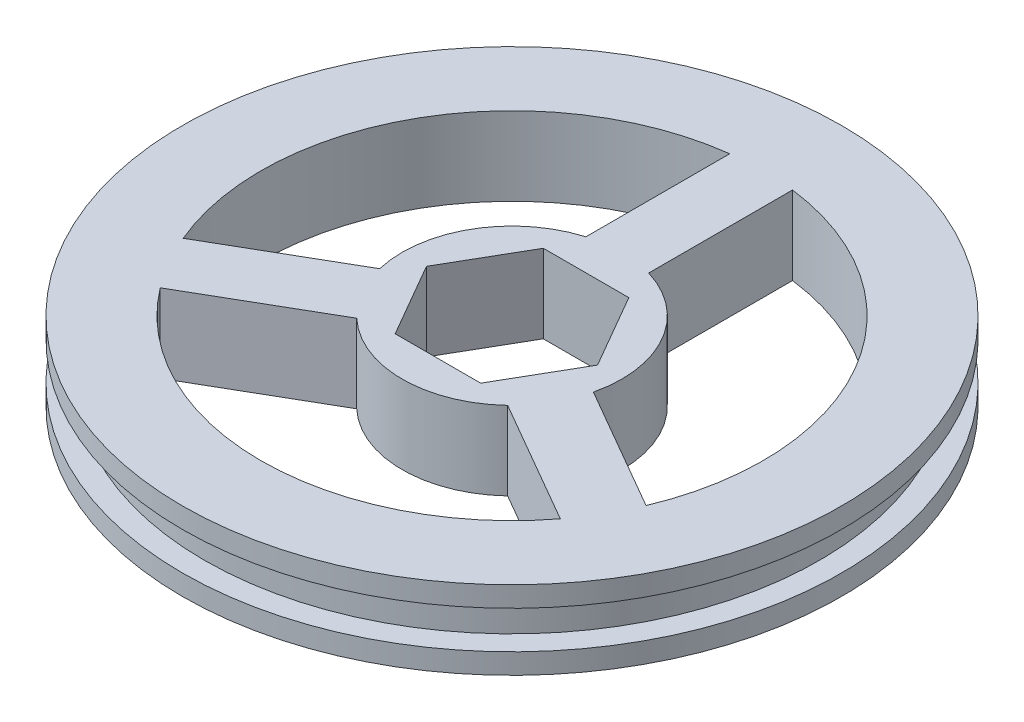
ISO-10303-21;
HEADER;
FILE_DESCRIPTION(('STEP AP214'),'2;1');
FILE_NAME('part.step','',(''),(''),'','','');
FILE_SCHEMA(('AUTOMOTIVE_DESIGN { 1 0 10303 214 1 1 1 1 }'));
ENDSEC;
DATA;
#1=APPLICATION_CONTEXT('core data for automotive mechanical design processes');
#2=APPLICATION_PROTOCOL_DEFINITION('international standard','automotive_design',2000,#1);
#3=PRODUCT_CONTEXT('',#1,'mechanical');
#4=PRODUCT('Part','Part','',(#3));
#5=PRODUCT_RELATED_PRODUCT_CATEGORY('part','',(#4));
#6=PRODUCT_DEFINITION_FORMATION('','',#4);
#7=PRODUCT_DEFINITION_CONTEXT('part definition',#1,'design');
#8=PRODUCT_DEFINITION('design','',#6,#7);
#9=PRODUCT_DEFINITION_SHAPE('','',#8);
#10=(LENGTH_UNIT() NAMED_UNIT(*) SI_UNIT(.MILLI.,.METRE.));
#11=(NAMED_UNIT(*) PLANE_ANGLE_UNIT() SI_UNIT($,.RADIAN.));
#12=(NAMED_UNIT(*) SI_UNIT($,.STERADIAN.) SOLID_ANGLE_UNIT());
#13=UNCERTAINTY_MEASURE_WITH_UNIT(LENGTH_MEASURE(1.E-05),#10,'distance_accuracy_value','');
#14=(GEOMETRIC_REPRESENTATION_CONTEXT(3) GLOBAL_UNCERTAINTY_ASSIGNED_CONTEXT((#13)) GLOBAL_UNIT_ASSIGNED_CONTEXT((#10,
#11,#12)) REPRESENTATION_CONTEXT('',''));
#15=CARTESIAN_POINT('',(0.,0.,0.));
#16=DIRECTION('',(0.,0.,1.));
#17=DIRECTION('',(1.,0.,0.));
#18=AXIS2_PLACEMENT_3D('',#15,#16,#17);
#19=CARTESIAN_POINT('',(0.,6.35,0.));
#20=DIRECTION('',(0.,-1.,0.));
#21=DIRECTION('',(0.,0.,-1.));
#22=AXIS2_PLACEMENT_3D('',#19,#20,#21);
#23=CYLINDRICAL_SURFACE('',#22,26.67);
#24=CARTESIAN_POINT('',(0.,0.,0.));
#25=DIRECTION('',(0.,1.,0.));
#26=DIRECTION('',(0.,0.,1.));
#27=AXIS2_PLACEMENT_3D('',#24,#25,#26);
#28=CIRCLE('',#27,26.67);
#29=CARTESIAN_POINT('',(0.,0.,26.67));
#30=VERTEX_POINT('',#29);
#31=EDGE_CURVE('E378',#30,#30,#28,.T.);
#32=ORIENTED_EDGE('',*,*,#31,.T.);
#33=EDGE_LOOP('',(#32));
#34=FACE_BOUND('',#33,.T.);
#35=CARTESIAN_POINT('',(0.,1.651,0.));
#36=DIRECTION('',(0.,1.,0.));
#37=DIRECTION('',(0.,0.,1.));
#38=AXIS2_PLACEMENT_3D('',#35,#36,#37);
#39=CIRCLE('',#38,26.67);
#40=CARTESIAN_POINT('',(0.,1.651,26.67));
#41=VERTEX_POINT('',#40);
#42=EDGE_CURVE('E273',#41,#41,#39,.T.);
#43=ORIENTED_EDGE('',*,*,#42,.F.);
#44=EDGE_LOOP('',(#43));
#45=FACE_BOUND('',#44,.T.);
#46=ADVANCED_FACE('F38',(#34,#45),#23,.T.);
#47=CARTESIAN_POINT('',(1.27000000000036,6.35,-2.19970452561312));
#48=DIRECTION('',(0.499999999999996,0.,-0.866025403784441));
#49=DIRECTION('',(-0.866025403784441,0.,-0.499999999999996));
#50=AXIS2_PLACEMENT_3D('',#47,#48,#49);
#51=PLANE('',#50);
#52=DIRECTION('',(0.866025403784441,0.,0.499999999999996));
#53=VECTOR('',#52,1.);
#54=CARTESIAN_POINT('',(1.27000000000036,0.,-2.19970452561312));
#55=LINE('',#54,#53);
#56=CARTESIAN_POINT('',(8.64803327452531,0.,2.06000497152384));
#57=VERTEX_POINT('',#56);
#58=CARTESIAN_POINT('',(18.7296133977821,0.,7.88060796954284));
#59=VERTEX_POINT('',#58);
#60=EDGE_CURVE('E405',#57,#59,#55,.T.);
#61=ORIENTED_EDGE('',*,*,#60,.F.);
#62=DIRECTION('',(0.,-1.,0.));
#63=VECTOR('',#62,1.);
#64=CARTESIAN_POINT('',(8.64803327452531,6.35,2.06000497152384));
#65=LINE('',#64,#63);
#66=CARTESIAN_POINT('',(8.64803327452531,6.35,2.06000497152384));
#67=VERTEX_POINT('',#66);
#68=EDGE_CURVE('E247',#67,#57,#65,.T.);
#69=ORIENTED_EDGE('',*,*,#68,.F.);
#70=DIRECTION('',(0.866025403784441,0.,0.499999999999996));
#71=VECTOR('',#70,1.);
#72=CARTESIAN_POINT('',(1.27000000000036,6.35,-2.19970452561312));
#73=LINE('',#72,#71);
#74=CARTESIAN_POINT('',(18.7296133977821,6.35,7.88060796954284));
#75=VERTEX_POINT('',#74);
#76=EDGE_CURVE('E349',#67,#75,#73,.T.);
#77=ORIENTED_EDGE('',*,*,#76,.T.);
#78=DIRECTION('',(0.,-1.,0.));
#79=VECTOR('',#78,1.);
#80=CARTESIAN_POINT('',(18.7296133977821,6.35,7.88060796954284));
#81=LINE('',#80,#79);
#82=EDGE_CURVE('E416',#75,#59,#81,.T.);
#83=ORIENTED_EDGE('',*,*,#82,.T.);
#84=EDGE_LOOP('',(#61,#69,#77,#83));
#85=FACE_BOUND('',#84,.T.);
#86=ADVANCED_FACE('F518',(#85),#51,.T.);
#87=CARTESIAN_POINT('',(0.,6.35,0.));
#88=DIRECTION('',(0.,-1.,0.));
#89=DIRECTION('',(0.,0.,-1.));
#90=AXIS2_PLACEMENT_3D('',#87,#88,#89);
#91=CYLINDRICAL_SURFACE('',#90,8.89);
#92=CARTESIAN_POINT('',(0.,0.,0.));
#93=DIRECTION('',(0.,1.,0.));
#94=DIRECTION('',(0.,0.,1.));
#95=AXIS2_PLACEMENT_3D('',#92,#93,#94);
#96=CIRCLE('',#95,8.89);
#97=CARTESIAN_POINT('',(2.54,0.,-8.5194189942742));
#98=VERTEX_POINT('',#97);
#99=EDGE_CURVE('E408',#57,#98,#96,.T.);
#100=ORIENTED_EDGE('',*,*,#99,.T.);
#101=DIRECTION('',(0.,-1.,0.));
#102=VECTOR('',#101,1.);
#103=CARTESIAN_POINT('',(2.54,6.35,-8.5194189942742));
#104=LINE('',#103,#102);
#105=CARTESIAN_POINT('',(2.54,6.35,-8.5194189942742));
#106=VERTEX_POINT('',#105);
#107=EDGE_CURVE('E421',#106,#98,#104,.T.);
#108=ORIENTED_EDGE('',*,*,#107,.F.);
#109=CARTESIAN_POINT('',(0.,6.35,0.));
#110=DIRECTION('',(0.,1.,0.));
#111=DIRECTION('',(0.,0.,1.));
#112=AXIS2_PLACEMENT_3D('',#109,#110,#111);
#113=CIRCLE('',#112,8.89);
#114=EDGE_CURVE('E352',#67,#106,#113,.T.);
#115=ORIENTED_EDGE('',*,*,#114,.F.);
#116=ORIENTED_EDGE('',*,*,#68,.T.);
#117=EDGE_LOOP('',(#100,#108,#115,#116));
#118=FACE_BOUND('',#117,.T.);
#119=ADVANCED_FACE('F525',(#118),#91,.T.);
#120=CARTESIAN_POINT('',(2.54,6.35,0.));
#121=DIRECTION('',(-1.,0.,0.));
#122=DIRECTION('',(0.,0.,1.));
#123=AXIS2_PLACEMENT_3D('',#120,#121,#122);
#124=PLANE('',#123);
#125=DIRECTION('',(0.,0.,-1.));
#126=VECTOR('',#125,1.);
#127=CARTESIAN_POINT('',(2.54,0.,0.));
#128=LINE('',#127,#126);
#129=CARTESIAN_POINT('',(2.54,0.,-20.1606249903122));
#130=VERTEX_POINT('',#129);
#131=EDGE_CURVE('E411',#98,#130,#128,.T.);
#132=ORIENTED_EDGE('',*,*,#131,.T.);
#133=DIRECTION('',(0.,-1.,0.));
#134=VECTOR('',#133,1.);
#135=CARTESIAN_POINT('',(2.54,6.35,-20.1606249903122));
#136=LINE('',#135,#134);
#137=CARTESIAN_POINT('',(2.54,6.35,-20.1606249903122));
#138=VERTEX_POINT('',#137);
#139=EDGE_CURVE('E418',#138,#130,#136,.T.);
#140=ORIENTED_EDGE('',*,*,#139,.F.);
#141=DIRECTION('',(0.,0.,-1.));
#142=VECTOR('',#141,1.);
#143=CARTESIAN_POINT('',(2.54,6.35,0.));
#144=LINE('',#143,#142);
#145=EDGE_CURVE('E355',#106,#138,#144,.T.);
#146=ORIENTED_EDGE('',*,*,#145,.F.);
#147=ORIENTED_EDGE('',*,*,#107,.T.);
#148=EDGE_LOOP('',(#132,#140,#146,#147));
#149=FACE_BOUND('',#148,.T.);
#150=ADVANCED_FACE('F572',(#149),#124,.F.);
#151=CARTESIAN_POINT('',(-2.54000000000006,6.35,0.));
#152=DIRECTION('',(-1.,0.,0.));
#153=DIRECTION('',(0.,0.,1.));
#154=AXIS2_PLACEMENT_3D('',#151,#152,#153);
#155=PLANE('',#154);
#156=DIRECTION('',(0.,0.,-1.));
#157=VECTOR('',#156,1.);
#158=CARTESIAN_POINT('',(-2.54000000000006,0.,0.));
#159=LINE('',#158,#157);
#160=CARTESIAN_POINT('',(-2.54000000000006,0.,-8.51941899427418));
#161=VERTEX_POINT('',#160);
#162=CARTESIAN_POINT('',(-2.54000000000006,0.,-20.1606249903122));
#163=VERTEX_POINT('',#162);
#164=EDGE_CURVE('E393',#161,#163,#159,.T.);
#165=ORIENTED_EDGE('',*,*,#164,.F.);
#166=DIRECTION('',(0.,-1.,0.));
#167=VECTOR('',#166,1.);
#168=CARTESIAN_POINT('',(-2.54000000000006,6.35,-8.51941899427418));
#169=LINE('',#168,#167);
#170=CARTESIAN_POINT('',(-2.54000000000006,6.35,-8.51941899427418));
#171=VERTEX_POINT('',#170);
#172=EDGE_CURVE('E419',#171,#161,#169,.T.);
#173=ORIENTED_EDGE('',*,*,#172,.F.);
#174=DIRECTION('',(0.,0.,-1.));
#175=VECTOR('',#174,1.);
#176=CARTESIAN_POINT('',(-2.54000000000006,6.35,0.));
#177=LINE('',#176,#175);
#178=CARTESIAN_POINT('',(-2.54000000000006,6.35,-20.1606249903122));
#179=VERTEX_POINT('',#178);
#180=EDGE_CURVE('E338',#171,#179,#177,.T.);
#181=ORIENTED_EDGE('',*,*,#180,.T.);
#182=DIRECTION('',(0.,-1.,0.));
#183=VECTOR('',#182,1.);
#184=CARTESIAN_POINT('',(-2.54000000000006,6.35,-20.1606249903122));
#185=LINE('',#184,#183);
#186=EDGE_CURVE('E425',#179,#163,#185,.T.);
#187=ORIENTED_EDGE('',*,*,#186,.T.);
#188=EDGE_LOOP('',(#165,#173,#181,#187));
#189=FACE_BOUND('',#188,.T.);
#190=ADVANCED_FACE('F553',(#189),#155,.T.);
#191=CARTESIAN_POINT('',(0.,6.35,0.));
#192=DIRECTION('',(0.,-1.,0.));
#193=DIRECTION('',(0.,0.,-1.));
#194=AXIS2_PLACEMENT_3D('',#191,#192,#193);
#195=CYLINDRICAL_SURFACE('',#194,8.89);
#196=CARTESIAN_POINT('',(0.,0.,0.));
#197=DIRECTION('',(0.,1.,0.));
#198=DIRECTION('',(0.,0.,1.));
#199=AXIS2_PLACEMENT_3D('',#196,#197,#198);
#200=CIRCLE('',#199,8.89);
#201=CARTESIAN_POINT('',(-8.64803327452513,0.,2.06000497152463));
#202=VERTEX_POINT('',#201);
#203=EDGE_CURVE('E396',#161,#202,#200,.T.);
#204=ORIENTED_EDGE('',*,*,#203,.T.);
#205=DIRECTION('',(0.,-1.,0.));
#206=VECTOR('',#205,1.);
#207=CARTESIAN_POINT('',(-8.64803327452513,6.35,2.06000497152463));
#208=LINE('',#207,#206);
#209=CARTESIAN_POINT('',(-8.64803327452513,6.35,2.06000497152463));
#210=VERTEX_POINT('',#209);
#211=EDGE_CURVE('E430',#210,#202,#208,.T.);
#212=ORIENTED_EDGE('',*,*,#211,.F.);
#213=CARTESIAN_POINT('',(0.,6.35,0.));
#214=DIRECTION('',(0.,1.,0.));
#215=DIRECTION('',(0.,0.,1.));
#216=AXIS2_PLACEMENT_3D('',#213,#214,#215);
#217=CIRCLE('',#216,8.89);
#218=EDGE_CURVE('E341',#171,#210,#217,.T.);
#219=ORIENTED_EDGE('',*,*,#218,.F.);
#220=ORIENTED_EDGE('',*,*,#172,.T.);
#221=EDGE_LOOP('',(#204,#212,#219,#220));
#222=FACE_BOUND('',#221,.T.);
#223=ADVANCED_FACE('F558',(#222),#195,.T.);
#224=CARTESIAN_POINT('',(-1.27000000000025,6.35,-2.19970452561271));
#225=DIRECTION('',(0.500000000000034,0.,0.866025403784419));
#226=DIRECTION('',(0.866025403784419,0.,-0.500000000000034));
#227=AXIS2_PLACEMENT_3D('',#224,#225,#226);
#228=PLANE('',#227);
#229=DIRECTION('',(-0.866025403784419,0.,0.500000000000034));
#230=VECTOR('',#229,1.);
#231=CARTESIAN_POINT('',(-1.27000000000025,0.,-2.19970452561271));
#232=LINE('',#231,#230);
#233=CARTESIAN_POINT('',(-18.7296133977816,0.,7.88060796954404));
#234=VERTEX_POINT('',#233);
#235=EDGE_CURVE('E399',#202,#234,#232,.T.);
#236=ORIENTED_EDGE('',*,*,#235,.T.);
#237=DIRECTION('',(0.,-1.,0.));
#238=VECTOR('',#237,1.);
#239=CARTESIAN_POINT('',(-18.7296133977816,6.35,7.88060796954404));
#240=LINE('',#239,#238);
#241=CARTESIAN_POINT('',(-18.7296133977816,6.35,7.88060796954404));
#242=VERTEX_POINT('',#241);
#243=EDGE_CURVE('E427',#242,#234,#240,.T.);
#244=ORIENTED_EDGE('',*,*,#243,.F.);
#245=DIRECTION('',(-0.866025403784419,0.,0.500000000000034));
#246=VECTOR('',#245,1.);
#247=CARTESIAN_POINT('',(-1.27000000000025,6.35,-2.19970452561271));
#248=LINE('',#247,#246);
#249=EDGE_CURVE('E344',#210,#242,#248,.T.);
#250=ORIENTED_EDGE('',*,*,#249,.F.);
#251=ORIENTED_EDGE('',*,*,#211,.T.);
#252=EDGE_LOOP('',(#236,#244,#250,#251));
#253=FACE_BOUND('',#252,.T.);
#254=ADVANCED_FACE('F560',(#253),#228,.F.);
#255=CARTESIAN_POINT('',(1.27000000000026,6.35,2.19970452561293));
#256=DIRECTION('',(0.5,0.,0.866025403784439));
#257=DIRECTION('',(0.866025403784439,0.,-0.5));
#258=AXIS2_PLACEMENT_3D('',#255,#256,#257);
#259=PLANE('',#258);
#260=DIRECTION('',(-0.866025403784439,0.,0.5));
#261=VECTOR('',#260,1.);
#262=CARTESIAN_POINT('',(1.27000000000026,0.,2.19970452561293));
#263=LINE('',#262,#261);
#264=CARTESIAN_POINT('',(-6.10803327452474,0.,6.45941402274994));
#265=VERTEX_POINT('',#264);
#266=CARTESIAN_POINT('',(-16.1896133977814,0.,12.280017020769));
#267=VERTEX_POINT('',#266);
#268=EDGE_CURVE('E381',#265,#267,#263,.T.);
#269=ORIENTED_EDGE('',*,*,#268,.F.);
#270=DIRECTION('',(0.,-1.,0.));
#271=VECTOR('',#270,1.);
#272=CARTESIAN_POINT('',(-6.10803327452474,6.35,6.45941402274994));
#273=LINE('',#272,#271);
#274=CARTESIAN_POINT('',(-6.10803327452474,6.35,6.45941402274994));
#275=VERTEX_POINT('',#274);
#276=EDGE_CURVE('E428',#275,#265,#273,.T.);
#277=ORIENTED_EDGE('',*,*,#276,.F.);
#278=DIRECTION('',(-0.866025403784439,0.,0.5));
#279=VECTOR('',#278,1.);
#280=CARTESIAN_POINT('',(1.27000000000026,6.35,2.19970452561293));
#281=LINE('',#280,#279);
#282=CARTESIAN_POINT('',(-16.1896133977814,6.35,12.280017020769));
#283=VERTEX_POINT('',#282);
#284=EDGE_CURVE('E327',#275,#283,#281,.T.);
#285=ORIENTED_EDGE('',*,*,#284,.T.);
#286=DIRECTION('',(0.,-1.,0.));
#287=VECTOR('',#286,1.);
#288=CARTESIAN_POINT('',(-16.1896133977814,6.35,12.280017020769));
#289=LINE('',#288,#287);
#290=EDGE_CURVE('E434',#283,#267,#289,.T.);
#291=ORIENTED_EDGE('',*,*,#290,.T.);
#292=EDGE_LOOP('',(#269,#277,#285,#291));
#293=FACE_BOUND('',#292,.T.);
#294=ADVANCED_FACE('F498',(#293),#259,.T.);
#295=CARTESIAN_POINT('',(0.,6.35,0.));
#296=DIRECTION('',(0.,-1.,0.));
#297=DIRECTION('',(0.,0.,-1.));
#298=AXIS2_PLACEMENT_3D('',#295,#296,#297);
#299=CYLINDRICAL_SURFACE('',#298,8.89);
#300=CARTESIAN_POINT('',(0.,0.,0.));
#301=DIRECTION('',(0.,1.,0.));
#302=DIRECTION('',(0.,0.,1.));
#303=AXIS2_PLACEMENT_3D('',#300,#301,#302);
#304=CIRCLE('',#303,8.89);
#305=CARTESIAN_POINT('',(6.10803327452572,0.,6.45941402274902));
#306=VERTEX_POINT('',#305);
#307=EDGE_CURVE('E384',#265,#306,#304,.T.);
#308=ORIENTED_EDGE('',*,*,#307,.T.);
#309=DIRECTION('',(0.,-1.,0.));
#310=VECTOR('',#309,1.);
#311=CARTESIAN_POINT('',(6.10803327452572,6.35,6.45941402274902));
#312=LINE('',#311,#310);
#313=CARTESIAN_POINT('',(6.10803327452572,6.35,6.45941402274902));
#314=VERTEX_POINT('',#313);
#315=EDGE_CURVE('E439',#314,#306,#312,.T.);
#316=ORIENTED_EDGE('',*,*,#315,.F.);
#317=CARTESIAN_POINT('',(0.,6.35,0.));
#318=DIRECTION('',(0.,1.,0.));
#319=DIRECTION('',(0.,0.,1.));
#320=AXIS2_PLACEMENT_3D('',#317,#318,#319);
#321=CIRCLE('',#320,8.89);
#322=EDGE_CURVE('E330',#275,#314,#321,.T.);
#323=ORIENTED_EDGE('',*,*,#322,.F.);
#324=ORIENTED_EDGE('',*,*,#276,.T.);
#325=EDGE_LOOP('',(#308,#316,#323,#324));
#326=FACE_BOUND('',#325,.T.);
#327=ADVANCED_FACE('F501',(#326),#299,.T.);
#328=CARTESIAN_POINT('',(-1.26999999999961,6.35,2.1997045256118));
#329=DIRECTION('',(0.5,0.,-0.866025403784439));
#330=DIRECTION('',(-0.866025403784439,0.,-0.5));
#331=AXIS2_PLACEMENT_3D('',#328,#329,#330);
#332=PLANE('',#331);
#333=DIRECTION('',(0.866025403784439,0.,0.5));
#334=VECTOR('',#333,1.);
#335=CARTESIAN_POINT('',(-1.26999999999961,0.,2.1997045256118));
#336=LINE('',#335,#334);
#337=CARTESIAN_POINT('',(16.1896133977822,0.,12.2800170207679));
#338=VERTEX_POINT('',#337);
#339=EDGE_CURVE('E387',#306,#338,#336,.T.);
#340=ORIENTED_EDGE('',*,*,#339,.T.);
#341=DIRECTION('',(0.,-1.,0.));
#342=VECTOR('',#341,1.);
#343=CARTESIAN_POINT('',(16.1896133977822,6.35,12.2800170207679));
#344=LINE('',#343,#342);
#345=CARTESIAN_POINT('',(16.1896133977822,6.35,12.2800170207679));
#346=VERTEX_POINT('',#345);
#347=EDGE_CURVE('E436',#346,#338,#344,.T.);
#348=ORIENTED_EDGE('',*,*,#347,.F.);
#349=DIRECTION('',(0.866025403784439,0.,0.5));
#350=VECTOR('',#349,1.);
#351=CARTESIAN_POINT('',(-1.26999999999961,6.35,2.1997045256118));
#352=LINE('',#351,#350);
#353=EDGE_CURVE('E333',#314,#346,#352,.T.);
#354=ORIENTED_EDGE('',*,*,#353,.F.);
#355=ORIENTED_EDGE('',*,*,#315,.T.);
#356=EDGE_LOOP('',(#340,#348,#354,#355));
#357=FACE_BOUND('',#356,.T.);
#358=ADVANCED_FACE('F492',(#357),#332,.F.);
#359=CARTESIAN_POINT('',(-5.19130268044544,6.35,-2.9972));
#360=DIRECTION('',(0.866025403784438,0.,0.500000000000001));
#361=DIRECTION('',(0.500000000000001,0.,-0.866025403784438));
#362=AXIS2_PLACEMENT_3D('',#359,#360,#361);
#363=PLANE('',#362);
#364=DIRECTION('',(-0.500000000000001,0.,0.866025403784438));
#365=VECTOR('',#364,1.);
#366=CARTESIAN_POINT('',(-5.19130268044544,0.,-2.9972));
#367=LINE('',#366,#365);
#368=CARTESIAN_POINT('',(-3.46086845363026,0.,-5.9944));
#369=VERTEX_POINT('',#368);
#370=CARTESIAN_POINT('',(-6.92173690726059,0.,0.));
#371=VERTEX_POINT('',#370);
#372=EDGE_CURVE('E305',#369,#371,#367,.T.);
#373=ORIENTED_EDGE('',*,*,#372,.F.);
#374=DIRECTION('',(0.,-1.,0.));
#375=VECTOR('',#374,1.);
#376=CARTESIAN_POINT('',(-3.46086845363026,6.35,-5.9944));
#377=LINE('',#376,#375);
#378=CARTESIAN_POINT('',(-3.46086845363026,6.35,-5.9944));
#379=VERTEX_POINT('',#378);
#380=EDGE_CURVE('E437',#379,#369,#377,.T.);
#381=ORIENTED_EDGE('',*,*,#380,.F.);
#382=DIRECTION('',(-0.500000000000001,0.,0.866025403784438));
#383=VECTOR('',#382,1.);
#384=CARTESIAN_POINT('',(-5.19130268044544,6.35,-2.9972));
#385=LINE('',#384,#383);
#386=CARTESIAN_POINT('',(-6.92173690726059,6.35,0.));
#387=VERTEX_POINT('',#386);
#388=EDGE_CURVE('E306',#379,#387,#385,.T.);
#389=ORIENTED_EDGE('',*,*,#388,.T.);
#390=DIRECTION('',(0.,-1.,0.));
#391=VECTOR('',#390,1.);
#392=CARTESIAN_POINT('',(-6.92173690726059,6.35,0.));
#393=LINE('',#392,#391);
#394=EDGE_CURVE('E360',#387,#371,#393,.T.);
#395=ORIENTED_EDGE('',*,*,#394,.T.);
#396=EDGE_LOOP('',(#373,#381,#389,#395));
#397=FACE_BOUND('',#396,.T.);
#398=ADVANCED_FACE('F40',(#397),#363,.T.);
#399=CARTESIAN_POINT('',(0.,6.35,-5.9944));
#400=DIRECTION('',(0.,0.,-1.));
#401=DIRECTION('',(-1.,0.,0.));
#402=AXIS2_PLACEMENT_3D('',#399,#400,#401);
#403=PLANE('',#402);
#404=DIRECTION('',(1.,0.,0.));
#405=VECTOR('',#404,1.);
#406=CARTESIAN_POINT('',(0.,0.,-5.9944));
#407=LINE('',#406,#405);
#408=CARTESIAN_POINT('',(3.4608684536303,0.,-5.9944));
#409=VERTEX_POINT('',#408);
#410=EDGE_CURVE('E363',#369,#409,#407,.T.);
#411=ORIENTED_EDGE('',*,*,#410,.T.);
#412=DIRECTION('',(0.,-1.,0.));
#413=VECTOR('',#412,1.);
#414=CARTESIAN_POINT('',(3.4608684536303,6.35,-5.9944));
#415=LINE('',#414,#413);
#416=CARTESIAN_POINT('',(3.4608684536303,6.35,-5.9944));
#417=VERTEX_POINT('',#416);
#418=EDGE_CURVE('E450',#417,#409,#415,.T.);
#419=ORIENTED_EDGE('',*,*,#418,.F.);
#420=DIRECTION('',(1.,0.,0.));
#421=VECTOR('',#420,1.);
#422=CARTESIAN_POINT('',(0.,6.35,-5.9944));
#423=LINE('',#422,#421);
#424=EDGE_CURVE('E309',#379,#417,#423,.T.);
#425=ORIENTED_EDGE('',*,*,#424,.F.);
#426=ORIENTED_EDGE('',*,*,#380,.T.);
#427=EDGE_LOOP('',(#411,#419,#425,#426));
#428=FACE_BOUND('',#427,.T.);
#429=ADVANCED_FACE('F455',(#428),#403,.F.);
#430=CARTESIAN_POINT('',(5.19130268044545,6.35,-2.99719999999999));
#431=DIRECTION('',(-0.86602540378444,0.,0.499999999999998));
#432=DIRECTION('',(0.499999999999998,0.,0.86602540378444));
#433=AXIS2_PLACEMENT_3D('',#430,#431,#432);
#434=PLANE('',#433);
#435=DIRECTION('',(-0.499999999999998,0.,-0.86602540378444));
#436=VECTOR('',#435,1.);
#437=CARTESIAN_POINT('',(5.19130268044545,0.,-2.99719999999999));
#438=LINE('',#437,#436);
#439=CARTESIAN_POINT('',(6.92173690726058,0.,0.));
#440=VERTEX_POINT('',#439);
#441=EDGE_CURVE('E366',#440,#409,#438,.T.);
#442=ORIENTED_EDGE('',*,*,#441,.F.);
#443=DIRECTION('',(0.,-1.,0.));
#444=VECTOR('',#443,1.);
#445=CARTESIAN_POINT('',(6.92173690726058,6.35,0.));
#446=LINE('',#445,#444);
#447=CARTESIAN_POINT('',(6.92173690726058,6.35,0.));
#448=VERTEX_POINT('',#447);
#449=EDGE_CURVE('E448',#448,#440,#446,.T.);
#450=ORIENTED_EDGE('',*,*,#449,.F.);
#451=DIRECTION('',(-0.499999999999998,0.,-0.86602540378444));
#452=VECTOR('',#451,1.);
#453=CARTESIAN_POINT('',(5.19130268044545,6.35,-2.99719999999999));
#454=LINE('',#453,#452);
#455=EDGE_CURVE('E312',#448,#417,#454,.T.);
#456=ORIENTED_EDGE('',*,*,#455,.T.);
#457=ORIENTED_EDGE('',*,*,#418,.T.);
#458=EDGE_LOOP('',(#442,#450,#456,#457));
#459=FACE_BOUND('',#458,.T.);
#460=ADVANCED_FACE('F478',(#459),#434,.T.);
#461=CARTESIAN_POINT('',(5.19130268044545,6.35,2.99719999999999));
#462=DIRECTION('',(-0.86602540378444,0.,-0.499999999999998));
#463=DIRECTION('',(-0.499999999999998,0.,0.86602540378444));
#464=AXIS2_PLACEMENT_3D('',#461,#462,#463);
#465=PLANE('',#464);
#466=DIRECTION('',(0.499999999999998,0.,-0.86602540378444));
#467=VECTOR('',#466,1.);
#468=CARTESIAN_POINT('',(5.19130268044545,0.,2.99719999999999));
#469=LINE('',#468,#467);
#470=CARTESIAN_POINT('',(3.46086845363029,0.,5.9944));
#471=VERTEX_POINT('',#470);
#472=EDGE_CURVE('E369',#471,#440,#469,.T.);
#473=ORIENTED_EDGE('',*,*,#472,.F.);
#474=DIRECTION('',(0.,-1.,0.));
#475=VECTOR('',#474,1.);
#476=CARTESIAN_POINT('',(3.46086845363029,6.35,5.9944));
#477=LINE('',#476,#475);
#478=CARTESIAN_POINT('',(3.46086845363029,6.35,5.9944));
#479=VERTEX_POINT('',#478);
#480=EDGE_CURVE('E446',#479,#471,#477,.T.);
#481=ORIENTED_EDGE('',*,*,#480,.F.);
#482=DIRECTION('',(0.499999999999998,0.,-0.86602540378444));
#483=VECTOR('',#482,1.);
#484=CARTESIAN_POINT('',(5.19130268044545,6.35,2.99719999999999));
#485=LINE('',#484,#483);
#486=EDGE_CURVE('E315',#479,#448,#485,.T.);
#487=ORIENTED_EDGE('',*,*,#486,.T.);
#488=ORIENTED_EDGE('',*,*,#449,.T.);
#489=EDGE_LOOP('',(#473,#481,#487,#488));
#490=FACE_BOUND('',#489,.T.);
#491=ADVANCED_FACE('F475',(#490),#465,.T.);
#492=CARTESIAN_POINT('',(0.,6.35,5.9944));
#493=DIRECTION('',(0.,0.,-1.));
#494=DIRECTION('',(-1.,0.,0.));
#495=AXIS2_PLACEMENT_3D('',#492,#493,#494);
#496=PLANE('',#495);
#497=DIRECTION('',(1.,0.,0.));
#498=VECTOR('',#497,1.);
#499=CARTESIAN_POINT('',(0.,0.,5.9944));
#500=LINE('',#499,#498);
#501=CARTESIAN_POINT('',(-3.46086845363027,0.,5.9944));
#502=VERTEX_POINT('',#501);
#503=EDGE_CURVE('E372',#502,#471,#500,.T.);
#504=ORIENTED_EDGE('',*,*,#503,.F.);
#505=DIRECTION('',(0.,-1.,0.));
#506=VECTOR('',#505,1.);
#507=CARTESIAN_POINT('',(-3.46086845363027,6.35,5.9944));
#508=LINE('',#507,#506);
#509=CARTESIAN_POINT('',(-3.46086845363027,6.35,5.9944));
#510=VERTEX_POINT('',#509);
#511=EDGE_CURVE('E444',#510,#502,#508,.T.);
#512=ORIENTED_EDGE('',*,*,#511,.F.);
#513=DIRECTION('',(1.,0.,0.));
#514=VECTOR('',#513,1.);
#515=CARTESIAN_POINT('',(0.,6.35,5.9944));
#516=LINE('',#515,#514);
#517=EDGE_CURVE('E318',#510,#479,#516,.T.);
#518=ORIENTED_EDGE('',*,*,#517,.T.);
#519=ORIENTED_EDGE('',*,*,#480,.T.);
#520=EDGE_LOOP('',(#504,#512,#518,#519));
#521=FACE_BOUND('',#520,.T.);
#522=ADVANCED_FACE('F471',(#521),#496,.T.);
#523=CARTESIAN_POINT('',(0.,6.35,0.));
#524=DIRECTION('',(0.,-1.,0.));
#525=DIRECTION('',(0.,0.,-1.));
#526=AXIS2_PLACEMENT_3D('',#523,#524,#525);
#527=CYLINDRICAL_SURFACE('',#526,20.32);
#528=CARTESIAN_POINT('',(0.,0.,0.));
#529=DIRECTION('',(0.,1.,0.));
#530=DIRECTION('',(0.,0.,1.));
#531=AXIS2_PLACEMENT_3D('',#528,#529,#530);
#532=CIRCLE('',#531,20.32);
#533=EDGE_CURVE('E402',#163,#234,#532,.T.);
#534=ORIENTED_EDGE('',*,*,#533,.F.);
#535=ORIENTED_EDGE('',*,*,#186,.F.);
#536=CARTESIAN_POINT('',(0.,6.35,0.));
#537=DIRECTION('',(0.,1.,0.));
#538=DIRECTION('',(0.,0.,1.));
#539=AXIS2_PLACEMENT_3D('',#536,#537,#538);
#540=CIRCLE('',#539,20.32);
#541=EDGE_CURVE('E346',#179,#242,#540,.T.);
#542=ORIENTED_EDGE('',*,*,#541,.T.);
#543=ORIENTED_EDGE('',*,*,#243,.T.);
#544=EDGE_LOOP('',(#534,#535,#542,#543));
#545=FACE_BOUND('',#544,.T.);
#546=ADVANCED_FACE('F537',(#545),#527,.F.);
#547=CARTESIAN_POINT('',(0.,6.35,0.));
#548=DIRECTION('',(0.,-1.,0.));
#549=DIRECTION('',(0.,0.,-1.));
#550=AXIS2_PLACEMENT_3D('',#547,#548,#549);
#551=CYLINDRICAL_SURFACE('',#550,20.32);
#552=CARTESIAN_POINT('',(0.,0.,0.));
#553=DIRECTION('',(0.,1.,0.));
#554=DIRECTION('',(0.,0.,1.));
#555=AXIS2_PLACEMENT_3D('',#552,#553,#554);
#556=CIRCLE('',#555,20.32);
#557=EDGE_CURVE('E390',#267,#338,#556,.T.);
#558=ORIENTED_EDGE('',*,*,#557,.F.);
#559=ORIENTED_EDGE('',*,*,#290,.F.);
#560=CARTESIAN_POINT('',(0.,6.35,0.));
#561=DIRECTION('',(0.,1.,0.));
#562=DIRECTION('',(0.,0.,1.));
#563=AXIS2_PLACEMENT_3D('',#560,#561,#562);
#564=CIRCLE('',#563,20.32);
#565=EDGE_CURVE('E335',#283,#346,#564,.T.);
#566=ORIENTED_EDGE('',*,*,#565,.T.);
#567=ORIENTED_EDGE('',*,*,#347,.T.);
#568=EDGE_LOOP('',(#558,#559,#566,#567));
#569=FACE_BOUND('',#568,.T.);
#570=ADVANCED_FACE('F495',(#569),#551,.F.);
#571=CARTESIAN_POINT('',(0.,4.699,0.));
#572=DIRECTION('',(0.,1.,0.));
#573=DIRECTION('',(0.,0.,1.));
#574=AXIS2_PLACEMENT_3D('',#571,#572,#573);
#575=CIRCLE('',#574,26.67);
#576=CARTESIAN_POINT('',(0.,4.699,26.67));
#577=VERTEX_POINT('',#576);
#578=EDGE_CURVE('E285',#577,#577,#575,.T.);
#579=ORIENTED_EDGE('',*,*,#578,.T.);
#580=EDGE_LOOP('',(#579));
#581=FACE_BOUND('',#580,.T.);
#582=CARTESIAN_POINT('',(0.,6.35,0.));
#583=DIRECTION('',(0.,1.,0.));
#584=DIRECTION('',(0.,0.,1.));
#585=AXIS2_PLACEMENT_3D('',#582,#583,#584);
#586=CIRCLE('',#585,26.67);
#587=CARTESIAN_POINT('',(0.,6.35,26.67));
#588=VERTEX_POINT('',#587);
#589=EDGE_CURVE('E324',#588,#588,#586,.T.);
#590=ORIENTED_EDGE('',*,*,#589,.F.);
#591=EDGE_LOOP('',(#590));
#592=FACE_BOUND('',#591,.T.);
#593=ADVANCED_FACE('F521',(#581,#592),#23,.T.);
#594=CARTESIAN_POINT('',(-5.19130268044542,6.35,2.99720000000003));
#595=DIRECTION('',(0.866025403784436,0.,-0.500000000000004));
#596=DIRECTION('',(-0.500000000000004,0.,-0.866025403784436));
#597=AXIS2_PLACEMENT_3D('',#594,#595,#596);
#598=PLANE('',#597);
#599=DIRECTION('',(0.500000000000004,0.,0.866025403784436));
#600=VECTOR('',#599,1.);
#601=CARTESIAN_POINT('',(-5.19130268044542,0.,2.99720000000003));
#602=LINE('',#601,#600);
#603=EDGE_CURVE('E375',#371,#502,#602,.T.);
#604=ORIENTED_EDGE('',*,*,#603,.F.);
#605=ORIENTED_EDGE('',*,*,#394,.F.);
#606=DIRECTION('',(0.500000000000004,0.,0.866025403784436));
#607=VECTOR('',#606,1.);
#608=CARTESIAN_POINT('',(-5.19130268044542,6.35,2.99720000000003));
#609=LINE('',#608,#607);
#610=EDGE_CURVE('E321',#387,#510,#609,.T.);
#611=ORIENTED_EDGE('',*,*,#610,.T.);
#612=ORIENTED_EDGE('',*,*,#511,.T.);
#613=EDGE_LOOP('',(#604,#605,#611,#612));
#614=FACE_BOUND('',#613,.T.);
#615=ADVANCED_FACE('F467',(#614),#598,.T.);
#616=CARTESIAN_POINT('',(0.,6.35,0.));
#617=DIRECTION('',(0.,-1.,0.));
#618=DIRECTION('',(0.,0.,-1.));
#619=AXIS2_PLACEMENT_3D('',#616,#617,#618);
#620=CYLINDRICAL_SURFACE('',#619,20.32);
#621=CARTESIAN_POINT('',(0.,0.,0.));
#622=DIRECTION('',(0.,1.,0.));
#623=DIRECTION('',(0.,0.,1.));
#624=AXIS2_PLACEMENT_3D('',#621,#622,#623);
#625=CIRCLE('',#624,20.32);
#626=EDGE_CURVE('E310',#59,#130,#625,.T.);
#627=ORIENTED_EDGE('',*,*,#626,.F.);
#628=ORIENTED_EDGE('',*,*,#82,.F.);
#629=CARTESIAN_POINT('',(0.,6.35,0.));
#630=DIRECTION('',(0.,1.,0.));
#631=DIRECTION('',(0.,0.,1.));
#632=AXIS2_PLACEMENT_3D('',#629,#630,#631);
#633=CIRCLE('',#632,20.32);
#634=EDGE_CURVE('E357',#75,#138,#633,.T.);
#635=ORIENTED_EDGE('',*,*,#634,.T.);
#636=ORIENTED_EDGE('',*,*,#139,.T.);
#637=EDGE_LOOP('',(#627,#628,#635,#636));
#638=FACE_BOUND('',#637,.T.);
#639=ADVANCED_FACE('F483',(#638),#620,.F.);
#640=CARTESIAN_POINT('',(0.,6.35,0.));
#641=DIRECTION('',(0.,1.,0.));
#642=DIRECTION('',(0.,0.,1.));
#643=AXIS2_PLACEMENT_3D('',#640,#641,#642);
#644=PLANE('',#643);
#645=ORIENTED_EDGE('',*,*,#589,.T.);
#646=EDGE_LOOP('',(#645));
#647=FACE_BOUND('',#646,.T.);
#648=ORIENTED_EDGE('',*,*,#634,.F.);
#649=ORIENTED_EDGE('',*,*,#76,.F.);
#650=ORIENTED_EDGE('',*,*,#114,.T.);
#651=ORIENTED_EDGE('',*,*,#145,.T.);
#652=EDGE_LOOP('',(#648,#649,#650,#651));
#653=FACE_BOUND('',#652,.T.);
#654=ORIENTED_EDGE('',*,*,#541,.F.);
#655=ORIENTED_EDGE('',*,*,#180,.F.);
#656=ORIENTED_EDGE('',*,*,#218,.T.);
#657=ORIENTED_EDGE('',*,*,#249,.T.);
#658=EDGE_LOOP('',(#654,#655,#656,#657));
#659=FACE_BOUND('',#658,.T.);
#660=ORIENTED_EDGE('',*,*,#388,.F.);
#661=ORIENTED_EDGE('',*,*,#424,.T.);
#662=ORIENTED_EDGE('',*,*,#455,.F.);
#663=ORIENTED_EDGE('',*,*,#486,.F.);
#664=ORIENTED_EDGE('',*,*,#517,.F.);
#665=ORIENTED_EDGE('',*,*,#610,.F.);
#666=EDGE_LOOP('',(#660,#661,#662,#663,#664,#665));
#667=FACE_BOUND('',#666,.T.);
#668=ORIENTED_EDGE('',*,*,#353,.T.);
#669=ORIENTED_EDGE('',*,*,#565,.F.);
#670=ORIENTED_EDGE('',*,*,#284,.F.);
#671=ORIENTED_EDGE('',*,*,#322,.T.);
#672=EDGE_LOOP('',(#668,#669,#670,#671));
#673=FACE_BOUND('',#672,.T.);
#674=ADVANCED_FACE('F480',(#647,#653,#659,#667,#673),#644,.T.);
#675=CARTESIAN_POINT('',(0.,0.,0.));
#676=DIRECTION('',(0.,1.,0.));
#677=DIRECTION('',(0.,0.,1.));
#678=AXIS2_PLACEMENT_3D('',#675,#676,#677);
#679=PLANE('',#678);
#680=ORIENTED_EDGE('',*,*,#31,.F.);
#681=EDGE_LOOP('',(#680));
#682=FACE_BOUND('',#681,.T.);
#683=ORIENTED_EDGE('',*,*,#60,.T.);
#684=ORIENTED_EDGE('',*,*,#626,.T.);
#685=ORIENTED_EDGE('',*,*,#131,.F.);
#686=ORIENTED_EDGE('',*,*,#99,.F.);
#687=EDGE_LOOP('',(#683,#684,#685,#686));
#688=FACE_BOUND('',#687,.T.);
#689=ORIENTED_EDGE('',*,*,#164,.T.);
#690=ORIENTED_EDGE('',*,*,#533,.T.);
#691=ORIENTED_EDGE('',*,*,#235,.F.);
#692=ORIENTED_EDGE('',*,*,#203,.F.);
#693=EDGE_LOOP('',(#689,#690,#691,#692));
#694=FACE_BOUND('',#693,.T.);
#695=ORIENTED_EDGE('',*,*,#372,.T.);
#696=ORIENTED_EDGE('',*,*,#603,.T.);
#697=ORIENTED_EDGE('',*,*,#503,.T.);
#698=ORIENTED_EDGE('',*,*,#472,.T.);
#699=ORIENTED_EDGE('',*,*,#441,.T.);
#700=ORIENTED_EDGE('',*,*,#410,.F.);
#701=EDGE_LOOP('',(#695,#696,#697,#698,#699,#700));
#702=FACE_BOUND('',#701,.T.);
#703=ORIENTED_EDGE('',*,*,#557,.T.);
#704=ORIENTED_EDGE('',*,*,#339,.F.);
#705=ORIENTED_EDGE('',*,*,#307,.F.);
#706=ORIENTED_EDGE('',*,*,#268,.T.);
#707=EDGE_LOOP('',(#703,#704,#705,#706));
#708=FACE_BOUND('',#707,.T.);
#709=ADVANCED_FACE('F461',(#682,#688,#694,#702,#708),#679,.F.);
#710=CARTESIAN_POINT('',(0.,4.699,0.));
#711=DIRECTION('',(0.,1.,0.));
#712=DIRECTION('',(0.,0.,1.));
#713=AXIS2_PLACEMENT_3D('',#710,#711,#712);
#714=PLANE('',#713);
#715=CARTESIAN_POINT('',(0.,4.699,0.));
#716=DIRECTION('',(0.,1.,0.));
#717=DIRECTION('',(0.,0.,1.));
#718=AXIS2_PLACEMENT_3D('',#715,#716,#717);
#719=CIRCLE('',#718,24.892);
#720=CARTESIAN_POINT('',(0.,4.699,24.892));
#721=VERTEX_POINT('',#720);
#722=EDGE_CURVE('E280',#721,#721,#719,.T.);
#723=ORIENTED_EDGE('',*,*,#722,.T.);
#724=EDGE_LOOP('',(#723));
#725=FACE_BOUND('',#724,.T.);
#726=ORIENTED_EDGE('',*,*,#578,.F.);
#727=EDGE_LOOP('',(#726));
#728=FACE_BOUND('',#727,.T.);
#729=ADVANCED_FACE('F503',(#725,#728),#714,.F.);
#730=CARTESIAN_POINT('',(0.,1.651,0.));
#731=DIRECTION('',(0.,1.,0.));
#732=DIRECTION('',(0.,0.,1.));
#733=AXIS2_PLACEMENT_3D('',#730,#731,#732);
#734=PLANE('',#733);
#735=CARTESIAN_POINT('',(0.,1.651,0.));
#736=DIRECTION('',(0.,1.,0.));
#737=DIRECTION('',(0.,0.,1.));
#738=AXIS2_PLACEMENT_3D('',#735,#736,#737);
#739=CIRCLE('',#738,24.892);
#740=CARTESIAN_POINT('',(0.,1.651,24.892));
#741=VERTEX_POINT('',#740);
#742=EDGE_CURVE('E11',#741,#741,#739,.T.);
#743=ORIENTED_EDGE('',*,*,#742,.F.);
#744=EDGE_LOOP('',(#743));
#745=FACE_BOUND('',#744,.T.);
#746=ORIENTED_EDGE('',*,*,#42,.T.);
#747=EDGE_LOOP('',(#746));
#748=FACE_BOUND('',#747,.T.);
#749=ADVANCED_FACE('F509',(#745,#748),#734,.T.);
#750=CARTESIAN_POINT('',(0.,0.,0.));
#751=DIRECTION('',(0.,1.,0.));
#752=DIRECTION('',(0.,0.,1.));
#753=AXIS2_PLACEMENT_3D('',#750,#751,#752);
#754=CYLINDRICAL_SURFACE('',#753,24.892);
#755=ORIENTED_EDGE('',*,*,#742,.T.);
#756=EDGE_LOOP('',(#755));
#757=FACE_BOUND('',#756,.T.);
#758=ORIENTED_EDGE('',*,*,#722,.F.);
#759=EDGE_LOOP('',(#758));
#760=FACE_BOUND('',#759,.T.);
#761=ADVANCED_FACE('F724',(#757,#760),#754,.T.);
#762=CLOSED_SHELL('',(#46,#86,#119,#150,#190,#223,#254,#294,#327,#358,#398,#429,#460,#491,#522,
#546,#570,#593,#615,#639,#674,#709,#729,#749,#761));
#763=CARTESIAN_POINT('',(6.62111062209356,6.35,3.82269999999998));
#764=DIRECTION('',(-0.86602540378444,0.,-0.499999999999998));
#765=DIRECTION('',(-0.499999999999998,0.,0.86602540378444));
#766=AXIS2_PLACEMENT_3D('',#763,#764,#765);
#767=PLANE('',#766);
#768=DIRECTION('',(0.,-1.,0.));
#769=VECTOR('',#768,1.);
#770=CARTESIAN_POINT('',(6.17661062209394,6.35,4.5925965839637));
#771=LINE('',#770,#769);
#772=CARTESIAN_POINT('',(6.17661062209394,4.699,4.5925965839637));
#773=VERTEX_POINT('',#772);
#774=CARTESIAN_POINT('',(6.17661062209394,1.651,4.5925965839637));
#775=VERTEX_POINT('',#774);
#776=EDGE_CURVE('E303',#773,#775,#771,.T.);
#777=ORIENTED_EDGE('',*,*,#776,.T.);
#778=DIRECTION('',(0.499999999999998,0.,-0.86602540378444));
#779=VECTOR('',#778,1.);
#780=CARTESIAN_POINT('',(6.62111062209356,1.651,3.82269999999998));
#781=LINE('',#780,#779);
#782=CARTESIAN_POINT('',(7.06561062209393,1.651,3.05280341603496));
#783=VERTEX_POINT('',#782);
#784=EDGE_CURVE('E274',#775,#783,#781,.T.);
#785=ORIENTED_EDGE('',*,*,#784,.T.);
#786=DIRECTION('',(0.,1.,0.));
#787=VECTOR('',#786,1.);
#788=CARTESIAN_POINT('',(7.06561062209393,6.35,3.05280341603496));
#789=LINE('',#788,#787);
#790=CARTESIAN_POINT('',(7.06561062209393,4.699,3.05280341603496));
#791=VERTEX_POINT('',#790);
#792=EDGE_CURVE('E292',#783,#791,#789,.T.);
#793=ORIENTED_EDGE('',*,*,#792,.T.);
#794=DIRECTION('',(0.499999999999998,0.,-0.86602540378444));
#795=VECTOR('',#794,1.);
#796=CARTESIAN_POINT('',(6.62111062209356,4.699,3.82269999999998));
#797=LINE('',#796,#795);
#798=EDGE_CURVE('E898',#773,#791,#797,.T.);
#799=ORIENTED_EDGE('',*,*,#798,.F.);
#800=EDGE_LOOP('',(#777,#785,#793,#799));
#801=FACE_BOUND('',#800,.T.);
#802=ADVANCED_FACE('F669',(#801),#767,.F.);
#803=DIRECTION('',(0.866025403784439,0.,0.5));
#804=VECTOR('',#803,1.);
#805=CARTESIAN_POINT('',(-0.444499999999613,1.651,0.769896583963696));
#806=LINE('',#805,#804);
#807=CARTESIAN_POINT('',(17.1362866504891,1.651,10.9201684891887));
#808=VERTEX_POINT('',#807);
#809=EDGE_CURVE('E268',#775,#808,#806,.T.);
#810=ORIENTED_EDGE('',*,*,#809,.T.);
#811=CARTESIAN_POINT('',(0.,1.651,0.));
#812=DIRECTION('',(0.,1.,0.));
#813=DIRECTION('',(0.,0.,1.));
#814=AXIS2_PLACEMENT_3D('',#811,#812,#813);
#815=CIRCLE('',#814,20.32);
#816=CARTESIAN_POINT('',(18.025286650489,1.651,9.3803753212599));
#817=VERTEX_POINT('',#816);
#818=EDGE_CURVE('E47',#808,#817,#815,.T.);
#819=ORIENTED_EDGE('',*,*,#818,.T.);
#820=DIRECTION('',(0.866025403784441,0.,0.499999999999996));
#821=VECTOR('',#820,1.);
#822=CARTESIAN_POINT('',(0.444500000000365,1.651,-0.769896583965005));
#823=LINE('',#822,#821);
#824=EDGE_CURVE('E261',#783,#817,#823,.T.);
#825=ORIENTED_EDGE('',*,*,#824,.F.);
#826=ORIENTED_EDGE('',*,*,#784,.F.);
#827=EDGE_LOOP('',(#810,#819,#825,#826));
#828=FACE_BOUND('',#827,.T.);
#829=ADVANCED_FACE('F674',(#828),#734,.T.);
#830=CARTESIAN_POINT('',(0.,4.699,0.));
#831=DIRECTION('',(0.,1.,0.));
#832=DIRECTION('',(0.,0.,1.));
#833=AXIS2_PLACEMENT_3D('',#830,#831,#832);
#834=CIRCLE('',#833,20.32);
#835=CARTESIAN_POINT('',(17.1362866504891,4.699,10.9201684891887));
#836=VERTEX_POINT('',#835);
#837=CARTESIAN_POINT('',(18.025286650489,4.699,9.3803753212599));
#838=VERTEX_POINT('',#837);
#839=EDGE_CURVE('E902',#836,#838,#834,.T.);
#840=ORIENTED_EDGE('',*,*,#839,.F.);
#841=DIRECTION('',(0.866025403784439,0.,0.5));
#842=VECTOR('',#841,1.);
#843=CARTESIAN_POINT('',(-0.444499999999613,4.699,0.769896583963696));
#844=LINE('',#843,#842);
#845=EDGE_CURVE('E875',#773,#836,#844,.T.);
#846=ORIENTED_EDGE('',*,*,#845,.F.);
#847=ORIENTED_EDGE('',*,*,#798,.T.);
#848=DIRECTION('',(0.866025403784441,0.,0.499999999999996));
#849=VECTOR('',#848,1.);
#850=CARTESIAN_POINT('',(0.444500000000365,4.699,-0.769896583965005));
#851=LINE('',#850,#849);
#852=EDGE_CURVE('E884',#791,#838,#851,.T.);
#853=ORIENTED_EDGE('',*,*,#852,.T.);
#854=EDGE_LOOP('',(#840,#846,#847,#853));
#855=FACE_BOUND('',#854,.T.);
#856=ADVANCED_FACE('F512',(#855),#714,.F.);
#857=CARTESIAN_POINT('',(-0.444499999999613,6.35,0.769896583963696));
#858=DIRECTION('',(0.5,0.,-0.866025403784439));
#859=DIRECTION('',(-0.866025403784439,0.,-0.5));
#860=AXIS2_PLACEMENT_3D('',#857,#858,#859);
#861=PLANE('',#860);
#862=ORIENTED_EDGE('',*,*,#845,.T.);
#863=DIRECTION('',(0.,1.,0.));
#864=VECTOR('',#863,1.);
#865=CARTESIAN_POINT('',(17.1362866504891,0.,10.9201684891887));
#866=LINE('',#865,#864);
#867=EDGE_CURVE('E903',#836,#808,#866,.F.);
#868=ORIENTED_EDGE('',*,*,#867,.T.);
#869=ORIENTED_EDGE('',*,*,#809,.F.);
#870=ORIENTED_EDGE('',*,*,#776,.F.);
#871=EDGE_LOOP('',(#862,#868,#869,#870));
#872=FACE_BOUND('',#871,.T.);
#873=ADVANCED_FACE('F757',(#872),#861,.T.);
#874=CARTESIAN_POINT('',(0.444500000000365,6.35,-0.769896583965005));
#875=DIRECTION('',(0.499999999999996,0.,-0.866025403784441));
#876=DIRECTION('',(-0.866025403784441,0.,-0.499999999999996));
#877=AXIS2_PLACEMENT_3D('',#874,#875,#876);
#878=PLANE('',#877);
#879=DIRECTION('',(0.,1.,0.));
#880=VECTOR('',#879,1.);
#881=CARTESIAN_POINT('',(18.025286650489,0.,9.3803753212599));
#882=LINE('',#881,#880);
#883=EDGE_CURVE('E54',#838,#817,#882,.F.);
#884=ORIENTED_EDGE('',*,*,#883,.F.);
#885=ORIENTED_EDGE('',*,*,#852,.F.);
#886=ORIENTED_EDGE('',*,*,#792,.F.);
#887=ORIENTED_EDGE('',*,*,#824,.T.);
#888=EDGE_LOOP('',(#884,#885,#886,#887));
#889=FACE_BOUND('',#888,.T.);
#890=ADVANCED_FACE('F769',(#889),#878,.F.);
#891=CARTESIAN_POINT('',(0.,0.,0.));
#892=DIRECTION('',(0.,1.,0.));
#893=DIRECTION('',(0.,0.,1.));
#894=AXIS2_PLACEMENT_3D('',#891,#892,#893);
#895=CYLINDRICAL_SURFACE('',#894,20.32);
#896=ORIENTED_EDGE('',*,*,#867,.F.);
#897=ORIENTED_EDGE('',*,*,#839,.T.);
#898=ORIENTED_EDGE('',*,*,#883,.T.);
#899=ORIENTED_EDGE('',*,*,#818,.F.);
#900=EDGE_LOOP('',(#896,#897,#898,#899));
#901=FACE_BOUND('',#900,.T.);
#902=ADVANCED_FACE('F779',(#901),#895,.F.);
#903=CLOSED_SHELL('',(#802,#829,#856,#873,#890,#902));
#904=CARTESIAN_POINT('',(0.,6.35,-7.6454));
#905=DIRECTION('',(0.,0.,-1.));
#906=DIRECTION('',(-1.,0.,0.));
#907=AXIS2_PLACEMENT_3D('',#904,#905,#906);
#908=PLANE('',#907);
#909=DIRECTION('',(1.,0.,0.));
#910=VECTOR('',#909,1.);
#911=CARTESIAN_POINT('',(0.,4.699,-7.6454));
#912=LINE('',#911,#910);
#913=CARTESIAN_POINT('',(-0.889000000000058,4.699,-7.6454));
#914=VERTEX_POINT('',#913);
#915=CARTESIAN_POINT('',(0.889,4.699,-7.6454));
#916=VERTEX_POINT('',#915);
#917=EDGE_CURVE('E895',#914,#916,#912,.T.);
#918=ORIENTED_EDGE('',*,*,#917,.T.);
#919=DIRECTION('',(0.,1.,0.));
#920=VECTOR('',#919,1.);
#921=CARTESIAN_POINT('',(0.889,6.35,-7.6454));
#922=LINE('',#921,#920);
#923=CARTESIAN_POINT('',(0.889,1.651,-7.6454));
#924=VERTEX_POINT('',#923);
#925=EDGE_CURVE('E294',#924,#916,#922,.T.);
#926=ORIENTED_EDGE('',*,*,#925,.F.);
#927=DIRECTION('',(1.,0.,0.));
#928=VECTOR('',#927,1.);
#929=CARTESIAN_POINT('',(0.,1.651,-7.6454));
#930=LINE('',#929,#928);
#931=CARTESIAN_POINT('',(-0.889000000000058,1.651,-7.6454));
#932=VERTEX_POINT('',#931);
#933=EDGE_CURVE('E277',#932,#924,#930,.T.);
#934=ORIENTED_EDGE('',*,*,#933,.F.);
#935=DIRECTION('',(0.,-1.,0.));
#936=VECTOR('',#935,1.);
#937=CARTESIAN_POINT('',(-0.889000000000058,6.35,-7.6454));
#938=LINE('',#937,#936);
#939=EDGE_CURVE('E297',#914,#932,#938,.T.);
#940=ORIENTED_EDGE('',*,*,#939,.F.);
#941=EDGE_LOOP('',(#918,#926,#934,#940));
#942=FACE_BOUND('',#941,.T.);
#943=ADVANCED_FACE('F654',(#942),#908,.T.);
#944=DIRECTION('',(0.,0.,-1.));
#945=VECTOR('',#944,1.);
#946=CARTESIAN_POINT('',(0.889,1.651,0.));
#947=LINE('',#946,#945);
#948=CARTESIAN_POINT('',(0.889,1.651,-20.30054381045));
#949=VERTEX_POINT('',#948);
#950=EDGE_CURVE('E265',#924,#949,#947,.T.);
#951=ORIENTED_EDGE('',*,*,#950,.T.);
#952=CARTESIAN_POINT('',(-0.889000000000056,1.651,-20.30054381045));
#953=VERTEX_POINT('',#952);
#954=EDGE_CURVE('E246',#949,#953,#815,.T.);
#955=ORIENTED_EDGE('',*,*,#954,.T.);
#956=DIRECTION('',(0.,0.,-1.));
#957=VECTOR('',#956,1.);
#958=CARTESIAN_POINT('',(-0.889000000000059,1.651,0.));
#959=LINE('',#958,#957);
#960=EDGE_CURVE('E262',#932,#953,#959,.T.);
#961=ORIENTED_EDGE('',*,*,#960,.F.);
#962=ORIENTED_EDGE('',*,*,#933,.T.);
#963=EDGE_LOOP('',(#951,#955,#961,#962));
#964=FACE_BOUND('',#963,.T.);
#965=ADVANCED_FACE('F658',(#964),#734,.T.);
#966=CARTESIAN_POINT('',(0.889,4.699,-20.30054381045));
#967=VERTEX_POINT('',#966);
#968=CARTESIAN_POINT('',(-0.889000000000056,4.699,-20.30054381045));
#969=VERTEX_POINT('',#968);
#970=EDGE_CURVE('E906',#967,#969,#834,.T.);
#971=ORIENTED_EDGE('',*,*,#970,.F.);
#972=DIRECTION('',(0.,0.,-1.));
#973=VECTOR('',#972,1.);
#974=CARTESIAN_POINT('',(0.889,4.699,0.));
#975=LINE('',#974,#973);
#976=EDGE_CURVE('E295',#916,#967,#975,.T.);
#977=ORIENTED_EDGE('',*,*,#976,.F.);
#978=ORIENTED_EDGE('',*,*,#917,.F.);
#979=DIRECTION('',(0.,0.,-1.));
#980=VECTOR('',#979,1.);
#981=CARTESIAN_POINT('',(-0.889000000000059,4.699,0.));
#982=LINE('',#981,#980);
#983=EDGE_CURVE('E878',#914,#969,#982,.T.);
#984=ORIENTED_EDGE('',*,*,#983,.T.);
#985=EDGE_LOOP('',(#971,#977,#978,#984));
#986=FACE_BOUND('',#985,.T.);
#987=ADVANCED_FACE('F759',(#986),#714,.F.);
#988=CARTESIAN_POINT('',(-0.889000000000059,6.35,0.));
#989=DIRECTION('',(-1.,0.,0.));
#990=DIRECTION('',(0.,0.,1.));
#991=AXIS2_PLACEMENT_3D('',#988,#989,#990);
#992=PLANE('',#991);
#993=DIRECTION('',(0.,1.,0.));
#994=VECTOR('',#993,1.);
#995=CARTESIAN_POINT('',(-0.889000000000056,0.,-20.30054381045));
#996=LINE('',#995,#994);
#997=EDGE_CURVE('E62',#969,#953,#996,.F.);
#998=ORIENTED_EDGE('',*,*,#997,.F.);
#999=ORIENTED_EDGE('',*,*,#983,.F.);
#1000=ORIENTED_EDGE('',*,*,#939,.T.);
#1001=ORIENTED_EDGE('',*,*,#960,.T.);
#1002=EDGE_LOOP('',(#998,#999,#1000,#1001));
#1003=FACE_BOUND('',#1002,.T.);
#1004=ADVANCED_FACE('F803',(#1003),#992,.F.);
#1005=CARTESIAN_POINT('',(0.889,6.35,0.));
#1006=DIRECTION('',(-1.,0.,0.));
#1007=DIRECTION('',(0.,0.,1.));
#1008=AXIS2_PLACEMENT_3D('',#1005,#1006,#1007);
#1009=PLANE('',#1008);
#1010=ORIENTED_EDGE('',*,*,#976,.T.);
#1011=DIRECTION('',(0.,1.,0.));
#1012=VECTOR('',#1011,1.);
#1013=CARTESIAN_POINT('',(0.889,0.,-20.30054381045));
#1014=LINE('',#1013,#1012);
#1015=EDGE_CURVE('E914',#967,#949,#1014,.F.);
#1016=ORIENTED_EDGE('',*,*,#1015,.T.);
#1017=ORIENTED_EDGE('',*,*,#950,.F.);
#1018=ORIENTED_EDGE('',*,*,#925,.T.);
#1019=EDGE_LOOP('',(#1010,#1016,#1017,#1018));
#1020=FACE_BOUND('',#1019,.T.);
#1021=ADVANCED_FACE('F812',(#1020),#1009,.T.);
#1022=ORIENTED_EDGE('',*,*,#1015,.F.);
#1023=ORIENTED_EDGE('',*,*,#970,.T.);
#1024=ORIENTED_EDGE('',*,*,#997,.T.);
#1025=ORIENTED_EDGE('',*,*,#954,.F.);
#1026=EDGE_LOOP('',(#1022,#1023,#1024,#1025));
#1027=FACE_BOUND('',#1026,.T.);
#1028=ADVANCED_FACE('F789',(#1027),#895,.F.);
#1029=CLOSED_SHELL('',(#943,#965,#987,#1004,#1021,#1028));
#1030=CARTESIAN_POINT('',(-6.62111062209353,6.35,3.82270000000003));
#1031=DIRECTION('',(0.866025403784436,0.,-0.500000000000004));
#1032=DIRECTION('',(-0.500000000000004,0.,-0.866025403784436));
#1033=AXIS2_PLACEMENT_3D('',#1030,#1031,#1032);
#1034=PLANE('',#1033);
#1035=DIRECTION('',(0.,1.,0.));
#1036=VECTOR('',#1035,1.);
#1037=CARTESIAN_POINT('',(-6.17661062209328,6.35,4.59259658396481));
#1038=LINE('',#1037,#1036);
#1039=CARTESIAN_POINT('',(-6.17661062209328,1.651,4.59259658396481));
#1040=VERTEX_POINT('',#1039);
#1041=CARTESIAN_POINT('',(-6.17661062209328,4.699,4.59259658396481));
#1042=VERTEX_POINT('',#1041);
#1043=EDGE_CURVE('E301',#1040,#1042,#1038,.T.);
#1044=ORIENTED_EDGE('',*,*,#1043,.T.);
#1045=DIRECTION('',(0.500000000000004,0.,0.866025403784436));
#1046=VECTOR('',#1045,1.);
#1047=CARTESIAN_POINT('',(-6.62111062209353,4.699,3.82270000000003));
#1048=LINE('',#1047,#1046);
#1049=CARTESIAN_POINT('',(-7.06561062209357,4.699,3.05280341603561));
#1050=VERTEX_POINT('',#1049);
#1051=EDGE_CURVE('E289',#1050,#1042,#1048,.T.);
#1052=ORIENTED_EDGE('',*,*,#1051,.F.);
#1053=DIRECTION('',(0.,-1.,0.));
#1054=VECTOR('',#1053,1.);
#1055=CARTESIAN_POINT('',(-7.06561062209357,6.35,3.05280341603561));
#1056=LINE('',#1055,#1054);
#1057=CARTESIAN_POINT('',(-7.06561062209357,1.651,3.05280341603561));
#1058=VERTEX_POINT('',#1057);
#1059=EDGE_CURVE('E299',#1050,#1058,#1056,.T.);
#1060=ORIENTED_EDGE('',*,*,#1059,.T.);
#1061=DIRECTION('',(0.500000000000004,0.,0.866025403784436));
#1062=VECTOR('',#1061,1.);
#1063=CARTESIAN_POINT('',(-6.62111062209353,1.651,3.82270000000003));
#1064=LINE('',#1063,#1062);
#1065=EDGE_CURVE('E260',#1058,#1040,#1064,.T.);
#1066=ORIENTED_EDGE('',*,*,#1065,.T.);
#1067=EDGE_LOOP('',(#1044,#1052,#1060,#1066));
#1068=FACE_BOUND('',#1067,.T.);
#1069=ADVANCED_FACE('F684',(#1068),#1034,.F.);
#1070=DIRECTION('',(-0.866025403784419,0.,0.500000000000034));
#1071=VECTOR('',#1070,1.);
#1072=CARTESIAN_POINT('',(-0.444500000000193,1.651,-0.769896583964632));
#1073=LINE('',#1072,#1071);
#1074=CARTESIAN_POINT('',(-18.0252866504884,1.651,9.38037532126105));
#1075=VERTEX_POINT('',#1074);
#1076=EDGE_CURVE('E252',#1058,#1075,#1073,.T.);
#1077=ORIENTED_EDGE('',*,*,#1076,.T.);
#1078=CARTESIAN_POINT('',(-17.1362866504884,1.651,10.9201684891898));
#1079=VERTEX_POINT('',#1078);
#1080=EDGE_CURVE('E235',#1075,#1079,#815,.T.);
#1081=ORIENTED_EDGE('',*,*,#1080,.T.);
#1082=DIRECTION('',(-0.866025403784439,0.,0.5));
#1083=VECTOR('',#1082,1.);
#1084=CARTESIAN_POINT('',(0.444500000000261,1.651,0.769896583964819));
#1085=LINE('',#1084,#1083);
#1086=EDGE_CURVE('E281',#1040,#1079,#1085,.T.);
#1087=ORIENTED_EDGE('',*,*,#1086,.F.);
#1088=ORIENTED_EDGE('',*,*,#1065,.F.);
#1089=EDGE_LOOP('',(#1077,#1081,#1087,#1088));
#1090=FACE_BOUND('',#1089,.T.);
#1091=ADVANCED_FACE('F258',(#1090),#734,.T.);
#1092=CARTESIAN_POINT('',(-18.0252866504884,4.699,9.38037532126104));
#1093=VERTEX_POINT('',#1092);
#1094=CARTESIAN_POINT('',(-17.1362866504884,4.699,10.9201684891898));
#1095=VERTEX_POINT('',#1094);
#1096=EDGE_CURVE('E255',#1093,#1095,#834,.T.);
#1097=ORIENTED_EDGE('',*,*,#1096,.F.);
#1098=DIRECTION('',(-0.866025403784419,0.,0.500000000000034));
#1099=VECTOR('',#1098,1.);
#1100=CARTESIAN_POINT('',(-0.444500000000193,4.699,-0.769896583964632));
#1101=LINE('',#1100,#1099);
#1102=EDGE_CURVE('E254',#1050,#1093,#1101,.T.);
#1103=ORIENTED_EDGE('',*,*,#1102,.F.);
#1104=ORIENTED_EDGE('',*,*,#1051,.T.);
#1105=DIRECTION('',(-0.866025403784439,0.,0.5));
#1106=VECTOR('',#1105,1.);
#1107=CARTESIAN_POINT('',(0.444500000000261,4.699,0.769896583964819));
#1108=LINE('',#1107,#1106);
#1109=EDGE_CURVE('E288',#1042,#1095,#1108,.T.);
#1110=ORIENTED_EDGE('',*,*,#1109,.T.);
#1111=EDGE_LOOP('',(#1097,#1103,#1104,#1110));
#1112=FACE_BOUND('',#1111,.T.);
#1113=ADVANCED_FACE('F513',(#1112),#714,.F.);
#1114=CARTESIAN_POINT('',(0.444500000000261,6.35,0.769896583964819));
#1115=DIRECTION('',(0.5,0.,0.866025403784439));
#1116=DIRECTION('',(0.866025403784439,0.,-0.5));
#1117=AXIS2_PLACEMENT_3D('',#1114,#1115,#1116);
#1118=PLANE('',#1117);
#1119=DIRECTION('',(0.,1.,0.));
#1120=VECTOR('',#1119,1.);
#1121=CARTESIAN_POINT('',(-17.1362866504884,0.,10.9201684891898));
#1122=LINE('',#1121,#1120);
#1123=EDGE_CURVE('E241',#1095,#1079,#1122,.F.);
#1124=ORIENTED_EDGE('',*,*,#1123,.F.);
#1125=ORIENTED_EDGE('',*,*,#1109,.F.);
#1126=ORIENTED_EDGE('',*,*,#1043,.F.);
#1127=ORIENTED_EDGE('',*,*,#1086,.T.);
#1128=EDGE_LOOP('',(#1124,#1125,#1126,#1127));
#1129=FACE_BOUND('',#1128,.T.);
#1130=ADVANCED_FACE('F841',(#1129),#1118,.F.);
#1131=CARTESIAN_POINT('',(-0.444500000000193,6.35,-0.769896583964632));
#1132=DIRECTION('',(0.500000000000034,0.,0.866025403784419));
#1133=DIRECTION('',(0.866025403784419,0.,-0.500000000000034));
#1134=AXIS2_PLACEMENT_3D('',#1131,#1132,#1133);
#1135=PLANE('',#1134);
#1136=ORIENTED_EDGE('',*,*,#1102,.T.);
#1137=DIRECTION('',(0.,1.,0.));
#1138=VECTOR('',#1137,1.);
#1139=CARTESIAN_POINT('',(-18.0252866504884,0.,9.38037532126104));
#1140=LINE('',#1139,#1138);
#1141=EDGE_CURVE('E238',#1093,#1075,#1140,.F.);
#1142=ORIENTED_EDGE('',*,*,#1141,.T.);
#1143=ORIENTED_EDGE('',*,*,#1076,.F.);
#1144=ORIENTED_EDGE('',*,*,#1059,.F.);
#1145=EDGE_LOOP('',(#1136,#1142,#1143,#1144));
#1146=FACE_BOUND('',#1145,.T.);
#1147=ADVANCED_FACE('F251',(#1146),#1135,.T.);
#1148=ORIENTED_EDGE('',*,*,#1141,.F.);
#1149=ORIENTED_EDGE('',*,*,#1096,.T.);
#1150=ORIENTED_EDGE('',*,*,#1123,.T.);
#1151=ORIENTED_EDGE('',*,*,#1080,.F.);
#1152=EDGE_LOOP('',(#1148,#1149,#1150,#1151));
#1153=FACE_BOUND('',#1152,.T.);
#1154=ADVANCED_FACE('F237',(#1153),#895,.F.);
#1155=CLOSED_SHELL('',(#1069,#1091,#1113,#1130,#1147,#1154));
#1156=ORIENTED_CLOSED_SHELL('',*,#903,.T.);
#1157=ORIENTED_CLOSED_SHELL('',*,#1029,.T.);
#1158=ORIENTED_CLOSED_SHELL('',*,#1155,.T.);
#1159=BREP_WITH_VOIDS('B2',#762,(#1156,#1157,#1158));
#1160=ADVANCED_BREP_SHAPE_REPRESENTATION('',(#18,#1159),#14);
#1161=SHAPE_DEFINITION_REPRESENTATION(#9,#1160);
ENDSEC;
END-ISO-10303-21;
